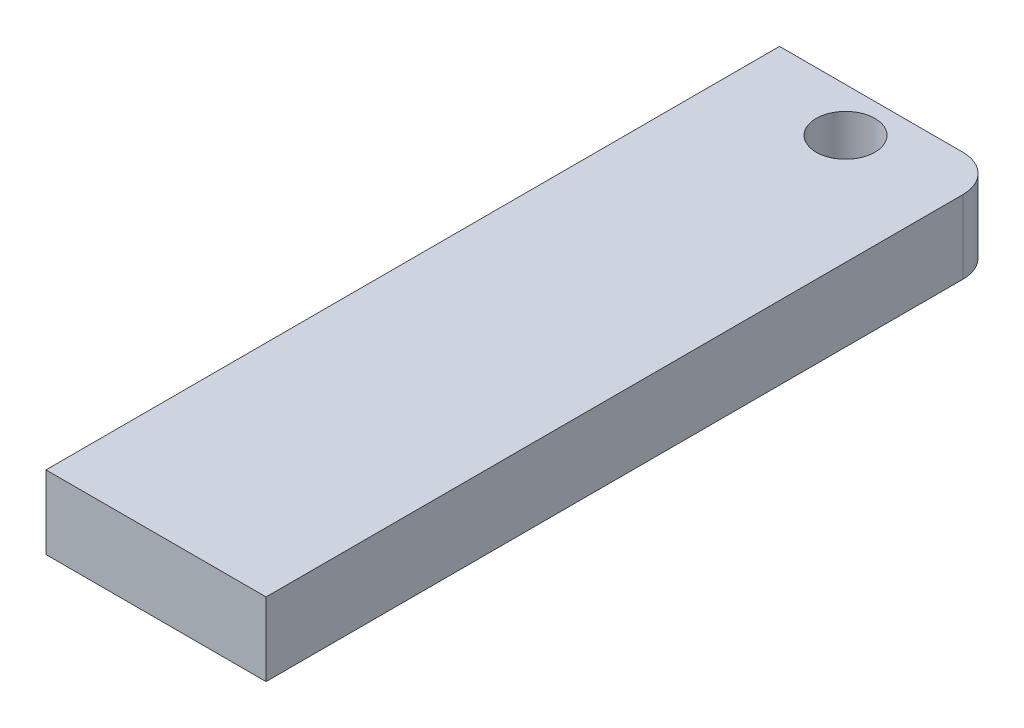
ISO-10303-21;
HEADER;
FILE_DESCRIPTION(('STEP AP214'),'2;1');
FILE_NAME('part.step','',(''),(''),'','','');
FILE_SCHEMA(('AUTOMOTIVE_DESIGN { 1 0 10303 214 1 1 1 1 }'));
ENDSEC;
DATA;
#1=APPLICATION_CONTEXT('core data for automotive mechanical design processes');
#2=APPLICATION_PROTOCOL_DEFINITION('international standard','automotive_design',2000,#1);
#3=PRODUCT_CONTEXT('',#1,'mechanical');
#4=PRODUCT('Part','Part','',(#3));
#5=PRODUCT_RELATED_PRODUCT_CATEGORY('part','',(#4));
#6=PRODUCT_DEFINITION_FORMATION('','',#4);
#7=PRODUCT_DEFINITION_CONTEXT('part definition',#1,'design');
#8=PRODUCT_DEFINITION('design','',#6,#7);
#9=PRODUCT_DEFINITION_SHAPE('','',#8);
#10=(LENGTH_UNIT() NAMED_UNIT(*) SI_UNIT(.MILLI.,.METRE.));
#11=(NAMED_UNIT(*) PLANE_ANGLE_UNIT() SI_UNIT($,.RADIAN.));
#12=(NAMED_UNIT(*) SI_UNIT($,.STERADIAN.) SOLID_ANGLE_UNIT());
#13=UNCERTAINTY_MEASURE_WITH_UNIT(LENGTH_MEASURE(1.E-05),#10,'distance_accuracy_value','');
#14=(GEOMETRIC_REPRESENTATION_CONTEXT(3) GLOBAL_UNCERTAINTY_ASSIGNED_CONTEXT((#13)) GLOBAL_UNIT_ASSIGNED_CONTEXT((#10,
#11,#12)) REPRESENTATION_CONTEXT('',''));
#15=CARTESIAN_POINT('',(0.,0.,0.));
#16=DIRECTION('',(0.,0.,1.));
#17=DIRECTION('',(1.,0.,0.));
#18=AXIS2_PLACEMENT_3D('',#15,#16,#17);
#19=CARTESIAN_POINT('',(0.,0.,100.));
#20=DIRECTION('',(1.,0.,0.));
#21=DIRECTION('',(0.,0.,-1.));
#22=AXIS2_PLACEMENT_3D('',#19,#20,#21);
#23=PLANE('',#22);
#24=DIRECTION('',(0.,-1.,0.));
#25=VECTOR('',#24,1.);
#26=CARTESIAN_POINT('',(0.,0.,0.));
#27=LINE('',#26,#25);
#28=CARTESIAN_POINT('',(0.,10.,0.));
#29=VERTEX_POINT('',#28);
#30=CARTESIAN_POINT('',(0.,0.,0.));
#31=VERTEX_POINT('',#30);
#32=EDGE_CURVE('E105',#29,#31,#27,.T.);
#33=ORIENTED_EDGE('',*,*,#32,.T.);
#34=DIRECTION('',(0.,0.,-1.));
#35=VECTOR('',#34,1.);
#36=CARTESIAN_POINT('',(0.,0.,100.));
#37=LINE('',#36,#35);
#38=CARTESIAN_POINT('',(0.,0.,100.));
#39=VERTEX_POINT('',#38);
#40=EDGE_CURVE('E86',#39,#31,#37,.T.);
#41=ORIENTED_EDGE('',*,*,#40,.F.);
#42=DIRECTION('',(0.,-1.,0.));
#43=VECTOR('',#42,1.);
#44=CARTESIAN_POINT('',(0.,0.,100.));
#45=LINE('',#44,#43);
#46=CARTESIAN_POINT('',(0.,10.,100.));
#47=VERTEX_POINT('',#46);
#48=EDGE_CURVE('E93',#47,#39,#45,.T.);
#49=ORIENTED_EDGE('',*,*,#48,.F.);
#50=DIRECTION('',(0.,0.,-1.));
#51=VECTOR('',#50,1.);
#52=CARTESIAN_POINT('',(0.,10.,100.));
#53=LINE('',#52,#51);
#54=EDGE_CURVE('E115',#47,#29,#53,.T.);
#55=ORIENTED_EDGE('',*,*,#54,.T.);
#56=EDGE_LOOP('',(#33,#41,#49,#55));
#57=FACE_BOUND('',#56,.T.);
#58=ADVANCED_FACE('F37',(#57),#23,.F.);
#59=CARTESIAN_POINT('',(0.,0.,100.));
#60=DIRECTION('',(0.,1.,0.));
#61=DIRECTION('',(0.,0.,1.));
#62=AXIS2_PLACEMENT_3D('',#59,#60,#61);
#63=PLANE('',#62);
#64=CARTESIAN_POINT('',(15.,0.,6.));
#65=DIRECTION('',(0.,1.,0.));
#66=DIRECTION('',(0.,0.,1.));
#67=AXIS2_PLACEMENT_3D('',#64,#65,#66);
#68=CIRCLE('',#67,4.);
#69=CARTESIAN_POINT('',(15.,0.,10.));
#70=VERTEX_POINT('',#69);
#71=EDGE_CURVE('E121',#70,#70,#68,.T.);
#72=ORIENTED_EDGE('',*,*,#71,.T.);
#73=EDGE_LOOP('',(#72));
#74=FACE_BOUND('',#73,.T.);
#75=DIRECTION('',(1.,0.,0.));
#76=VECTOR('',#75,1.);
#77=CARTESIAN_POINT('',(0.,0.,0.));
#78=LINE('',#77,#76);
#79=CARTESIAN_POINT('',(25.,0.,0.));
#80=VERTEX_POINT('',#79);
#81=EDGE_CURVE('E118',#31,#80,#78,.T.);
#82=ORIENTED_EDGE('',*,*,#81,.T.);
#83=CARTESIAN_POINT('',(25.,0.,5.));
#84=DIRECTION('',(0.,1.,0.));
#85=DIRECTION('',(0.,0.,1.));
#86=AXIS2_PLACEMENT_3D('',#83,#84,#85);
#87=CIRCLE('',#86,5.);
#88=CARTESIAN_POINT('',(30.,0.,5.));
#89=VERTEX_POINT('',#88);
#90=EDGE_CURVE('E11',#80,#89,#87,.F.);
#91=ORIENTED_EDGE('',*,*,#90,.T.);
#92=DIRECTION('',(0.,0.,-1.));
#93=VECTOR('',#92,1.);
#94=CARTESIAN_POINT('',(30.,0.,100.));
#95=LINE('',#94,#93);
#96=CARTESIAN_POINT('',(30.,0.,100.));
#97=VERTEX_POINT('',#96);
#98=EDGE_CURVE('E89',#97,#89,#95,.T.);
#99=ORIENTED_EDGE('',*,*,#98,.F.);
#100=DIRECTION('',(1.,0.,0.));
#101=VECTOR('',#100,1.);
#102=CARTESIAN_POINT('',(0.,0.,100.));
#103=LINE('',#102,#101);
#104=EDGE_CURVE('E82',#39,#97,#103,.T.);
#105=ORIENTED_EDGE('',*,*,#104,.F.);
#106=ORIENTED_EDGE('',*,*,#40,.T.);
#107=EDGE_LOOP('',(#82,#91,#99,#105,#106));
#108=FACE_BOUND('',#107,.T.);
#109=ADVANCED_FACE('F84',(#74,#108),#63,.F.);
#110=CARTESIAN_POINT('',(30.,0.,100.));
#111=DIRECTION('',(-1.,0.,0.));
#112=DIRECTION('',(0.,0.,1.));
#113=AXIS2_PLACEMENT_3D('',#110,#111,#112);
#114=PLANE('',#113);
#115=ORIENTED_EDGE('',*,*,#98,.T.);
#116=DIRECTION('',(0.,1.,0.));
#117=VECTOR('',#116,1.);
#118=CARTESIAN_POINT('',(30.,10.,5.));
#119=LINE('',#118,#117);
#120=CARTESIAN_POINT('',(30.,10.,5.));
#121=VERTEX_POINT('',#120);
#122=EDGE_CURVE('E106',#89,#121,#119,.T.);
#123=ORIENTED_EDGE('',*,*,#122,.T.);
#124=DIRECTION('',(0.,0.,-1.));
#125=VECTOR('',#124,1.);
#126=CARTESIAN_POINT('',(30.,10.,100.));
#127=LINE('',#126,#125);
#128=CARTESIAN_POINT('',(30.,10.,100.));
#129=VERTEX_POINT('',#128);
#130=EDGE_CURVE('E110',#129,#121,#127,.T.);
#131=ORIENTED_EDGE('',*,*,#130,.F.);
#132=DIRECTION('',(0.,1.,0.));
#133=VECTOR('',#132,1.);
#134=CARTESIAN_POINT('',(30.,0.,100.));
#135=LINE('',#134,#133);
#136=EDGE_CURVE('E92',#97,#129,#135,.T.);
#137=ORIENTED_EDGE('',*,*,#136,.F.);
#138=EDGE_LOOP('',(#115,#123,#131,#137));
#139=FACE_BOUND('',#138,.T.);
#140=ADVANCED_FACE('F135',(#139),#114,.F.);
#141=CARTESIAN_POINT('',(0.,10.,100.));
#142=DIRECTION('',(0.,-1.,0.));
#143=DIRECTION('',(0.,0.,-1.));
#144=AXIS2_PLACEMENT_3D('',#141,#142,#143);
#145=PLANE('',#144);
#146=CARTESIAN_POINT('',(15.,10.,6.));
#147=DIRECTION('',(0.,1.,0.));
#148=DIRECTION('',(0.,0.,1.));
#149=AXIS2_PLACEMENT_3D('',#146,#147,#148);
#150=CIRCLE('',#149,4.);
#151=CARTESIAN_POINT('',(15.,10.,10.));
#152=VERTEX_POINT('',#151);
#153=EDGE_CURVE('E126',#152,#152,#150,.T.);
#154=ORIENTED_EDGE('',*,*,#153,.F.);
#155=EDGE_LOOP('',(#154));
#156=FACE_BOUND('',#155,.T.);
#157=ORIENTED_EDGE('',*,*,#130,.T.);
#158=CARTESIAN_POINT('',(25.,10.,5.));
#159=DIRECTION('',(0.,-1.,0.));
#160=DIRECTION('',(0.,0.,-1.));
#161=AXIS2_PLACEMENT_3D('',#158,#159,#160);
#162=CIRCLE('',#161,5.);
#163=CARTESIAN_POINT('',(25.,10.,0.));
#164=VERTEX_POINT('',#163);
#165=EDGE_CURVE('E59',#121,#164,#162,.F.);
#166=ORIENTED_EDGE('',*,*,#165,.T.);
#167=DIRECTION('',(-1.,0.,0.));
#168=VECTOR('',#167,1.);
#169=CARTESIAN_POINT('',(0.,10.,0.));
#170=LINE('',#169,#168);
#171=EDGE_CURVE('E102',#164,#29,#170,.T.);
#172=ORIENTED_EDGE('',*,*,#171,.T.);
#173=ORIENTED_EDGE('',*,*,#54,.F.);
#174=DIRECTION('',(-1.,0.,0.));
#175=VECTOR('',#174,1.);
#176=CARTESIAN_POINT('',(0.,10.,100.));
#177=LINE('',#176,#175);
#178=EDGE_CURVE('E98',#129,#47,#177,.T.);
#179=ORIENTED_EDGE('',*,*,#178,.F.);
#180=EDGE_LOOP('',(#157,#166,#172,#173,#179));
#181=FACE_BOUND('',#180,.T.);
#182=ADVANCED_FACE('F133',(#156,#181),#145,.F.);
#183=CARTESIAN_POINT('',(0.,0.,100.));
#184=DIRECTION('',(0.,0.,-1.));
#185=DIRECTION('',(-1.,0.,0.));
#186=AXIS2_PLACEMENT_3D('',#183,#184,#185);
#187=PLANE('',#186);
#188=ORIENTED_EDGE('',*,*,#48,.T.);
#189=ORIENTED_EDGE('',*,*,#104,.T.);
#190=ORIENTED_EDGE('',*,*,#136,.T.);
#191=ORIENTED_EDGE('',*,*,#178,.T.);
#192=EDGE_LOOP('',(#188,#189,#190,#191));
#193=FACE_BOUND('',#192,.T.);
#194=ADVANCED_FACE('F96',(#193),#187,.F.);
#195=CARTESIAN_POINT('',(0.,0.,0.));
#196=DIRECTION('',(0.,0.,-1.));
#197=DIRECTION('',(-1.,0.,0.));
#198=AXIS2_PLACEMENT_3D('',#195,#196,#197);
#199=PLANE('',#198);
#200=ORIENTED_EDGE('',*,*,#171,.F.);
#201=DIRECTION('',(0.,1.,0.));
#202=VECTOR('',#201,1.);
#203=CARTESIAN_POINT('',(25.,0.,0.));
#204=LINE('',#203,#202);
#205=EDGE_CURVE('E45',#164,#80,#204,.F.);
#206=ORIENTED_EDGE('',*,*,#205,.T.);
#207=ORIENTED_EDGE('',*,*,#81,.F.);
#208=ORIENTED_EDGE('',*,*,#32,.F.);
#209=EDGE_LOOP('',(#200,#206,#207,#208));
#210=FACE_BOUND('',#209,.T.);
#211=ADVANCED_FACE('F142',(#210),#199,.T.);
#212=CARTESIAN_POINT('',(15.,-20.,6.));
#213=DIRECTION('',(0.,1.,0.));
#214=DIRECTION('',(0.,0.,1.));
#215=AXIS2_PLACEMENT_3D('',#212,#213,#214);
#216=CYLINDRICAL_SURFACE('',#215,4.);
#217=ORIENTED_EDGE('',*,*,#153,.T.);
#218=EDGE_LOOP('',(#217));
#219=FACE_BOUND('',#218,.T.);
#220=ORIENTED_EDGE('',*,*,#71,.F.);
#221=EDGE_LOOP('',(#220));
#222=FACE_BOUND('',#221,.T.);
#223=ADVANCED_FACE('F130',(#219,#222),#216,.F.);
#224=CARTESIAN_POINT('',(25.,0.,5.));
#225=DIRECTION('',(0.,-1.,0.));
#226=DIRECTION('',(0.,0.,-1.));
#227=AXIS2_PLACEMENT_3D('',#224,#225,#226);
#228=CYLINDRICAL_SURFACE('',#227,5.);
#229=ORIENTED_EDGE('',*,*,#90,.F.);
#230=ORIENTED_EDGE('',*,*,#205,.F.);
#231=ORIENTED_EDGE('',*,*,#165,.F.);
#232=ORIENTED_EDGE('',*,*,#122,.F.);
#233=EDGE_LOOP('',(#229,#230,#231,#232));
#234=FACE_BOUND('',#233,.T.);
#235=ADVANCED_FACE('F39',(#234),#228,.T.);
#236=CLOSED_SHELL('',(#58,#109,#140,#182,#194,#211,#223,#235));
#237=MANIFOLD_SOLID_BREP('B2',#236);
#238=ADVANCED_BREP_SHAPE_REPRESENTATION('',(#18,#237),#14);
#239=SHAPE_DEFINITION_REPRESENTATION(#9,#238);
ENDSEC;
END-ISO-10303-21;
